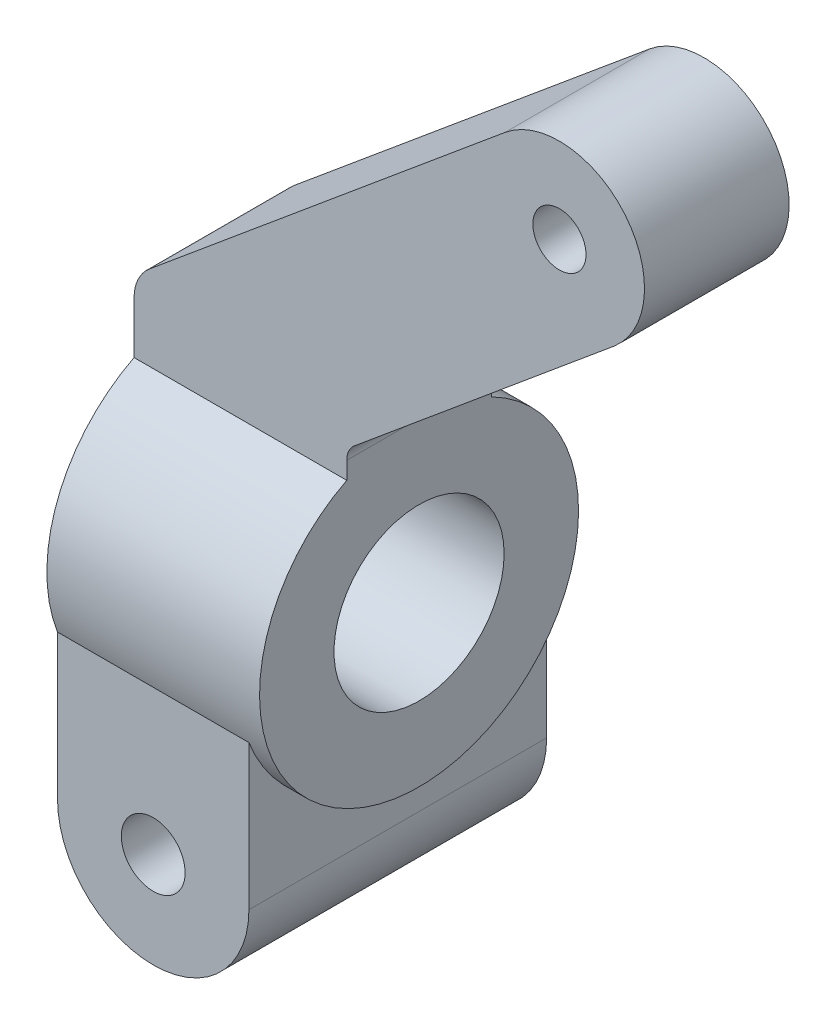
ISO-10303-21;
HEADER;
FILE_DESCRIPTION(('STEP AP214'),'2;1');
FILE_NAME('part.step','',(''),(''),'','','');
FILE_SCHEMA(('AUTOMOTIVE_DESIGN { 1 0 10303 214 1 1 1 1 }'));
ENDSEC;
DATA;
#1=APPLICATION_CONTEXT('core data for automotive mechanical design processes');
#2=APPLICATION_PROTOCOL_DEFINITION('international standard','automotive_design',2000,#1);
#3=PRODUCT_CONTEXT('',#1,'mechanical');
#4=PRODUCT('Part','Part','',(#3));
#5=PRODUCT_RELATED_PRODUCT_CATEGORY('part','',(#4));
#6=PRODUCT_DEFINITION_FORMATION('','',#4);
#7=PRODUCT_DEFINITION_CONTEXT('part definition',#1,'design');
#8=PRODUCT_DEFINITION('design','',#6,#7);
#9=PRODUCT_DEFINITION_SHAPE('','',#8);
#10=(LENGTH_UNIT() NAMED_UNIT(*) SI_UNIT(.MILLI.,.METRE.));
#11=(NAMED_UNIT(*) PLANE_ANGLE_UNIT() SI_UNIT($,.RADIAN.));
#12=(NAMED_UNIT(*) SI_UNIT($,.STERADIAN.) SOLID_ANGLE_UNIT());
#13=UNCERTAINTY_MEASURE_WITH_UNIT(LENGTH_MEASURE(1.E-05),#10,'distance_accuracy_value','');
#14=(GEOMETRIC_REPRESENTATION_CONTEXT(3) GLOBAL_UNCERTAINTY_ASSIGNED_CONTEXT((#13)) GLOBAL_UNIT_ASSIGNED_CONTEXT((#10,
#11,#12)) REPRESENTATION_CONTEXT('',''));
#15=CARTESIAN_POINT('',(0.,0.,0.));
#16=DIRECTION('',(0.,0.,1.));
#17=DIRECTION('',(1.,0.,0.));
#18=AXIS2_PLACEMENT_3D('',#15,#16,#17);
#19=CARTESIAN_POINT('',(10.,0.,0.));
#20=DIRECTION('',(-1.,0.,0.));
#21=DIRECTION('',(0.,0.,1.));
#22=AXIS2_PLACEMENT_3D('',#19,#20,#21);
#23=CYLINDRICAL_SURFACE('',#22,7.50000000000001);
#24=CARTESIAN_POINT('',(0.,0.,0.));
#25=DIRECTION('',(1.,0.,0.));
#26=DIRECTION('',(0.,0.,-1.));
#27=AXIS2_PLACEMENT_3D('',#24,#25,#26);
#28=CIRCLE('',#27,7.50000000000001);
#29=CARTESIAN_POINT('',(0.,6.68505796534332,3.4));
#30=VERTEX_POINT('',#29);
#31=CARTESIAN_POINT('',(0.,-2.69258240356727,7.));
#32=VERTEX_POINT('',#31);
#33=EDGE_CURVE('E209',#30,#32,#28,.T.);
#34=ORIENTED_EDGE('',*,*,#33,.T.);
#35=DIRECTION('',(-1.,0.,0.));
#36=VECTOR('',#35,1.);
#37=CARTESIAN_POINT('',(10.,-2.69258240356727,7.));
#38=LINE('',#37,#36);
#39=CARTESIAN_POINT('',(9.,-2.69258240356727,7.));
#40=VERTEX_POINT('',#39);
#41=EDGE_CURVE('E50',#32,#40,#38,.F.);
#42=ORIENTED_EDGE('',*,*,#41,.T.);
#43=CARTESIAN_POINT('',(9.,0.,0.));
#44=DIRECTION('',(1.,0.,0.));
#45=DIRECTION('',(0.,0.,-1.));
#46=AXIS2_PLACEMENT_3D('',#43,#44,#45);
#47=CIRCLE('',#46,7.50000000000001);
#48=CARTESIAN_POINT('',(9.,-2.69258240356727,-7.));
#49=VERTEX_POINT('',#48);
#50=EDGE_CURVE('E11',#40,#49,#47,.T.);
#51=ORIENTED_EDGE('',*,*,#50,.T.);
#52=DIRECTION('',(-1.,0.,0.));
#53=VECTOR('',#52,1.);
#54=CARTESIAN_POINT('',(10.,-2.69258240356727,-7.));
#55=LINE('',#54,#53);
#56=CARTESIAN_POINT('',(0.,-2.69258240356727,-7.));
#57=VERTEX_POINT('',#56);
#58=EDGE_CURVE('E56',#57,#49,#55,.F.);
#59=ORIENTED_EDGE('',*,*,#58,.F.);
#60=CARTESIAN_POINT('',(0.,6.68505796534332,-3.4));
#61=VERTEX_POINT('',#60);
#62=EDGE_CURVE('E206',#57,#61,#28,.T.);
#63=ORIENTED_EDGE('',*,*,#62,.T.);
#64=DIRECTION('',(-1.,0.,0.));
#65=VECTOR('',#64,1.);
#66=CARTESIAN_POINT('',(10.,6.68505796534332,-3.4));
#67=LINE('',#66,#65);
#68=CARTESIAN_POINT('',(10.,6.68505796534332,-3.4));
#69=VERTEX_POINT('',#68);
#70=EDGE_CURVE('E201',#69,#61,#67,.T.);
#71=ORIENTED_EDGE('',*,*,#70,.F.);
#72=CARTESIAN_POINT('',(10.,0.,0.));
#73=DIRECTION('',(1.,0.,0.));
#74=DIRECTION('',(0.,0.,-1.));
#75=AXIS2_PLACEMENT_3D('',#72,#73,#74);
#76=CIRCLE('',#75,7.50000000000001);
#77=CARTESIAN_POINT('',(10.,6.68505796534332,3.4));
#78=VERTEX_POINT('',#77);
#79=EDGE_CURVE('E43',#78,#69,#76,.T.);
#80=ORIENTED_EDGE('',*,*,#79,.F.);
#81=DIRECTION('',(-1.,0.,0.));
#82=VECTOR('',#81,1.);
#83=CARTESIAN_POINT('',(10.,6.68505796534332,3.4));
#84=LINE('',#83,#82);
#85=EDGE_CURVE('E204',#78,#30,#84,.T.);
#86=ORIENTED_EDGE('',*,*,#85,.T.);
#87=EDGE_LOOP('',(#34,#42,#51,#59,#63,#71,#80,#86));
#88=FACE_BOUND('',#87,.T.);
#89=ADVANCED_FACE('F35',(#88),#23,.T.);
#90=CARTESIAN_POINT('',(10.,0.,0.));
#91=DIRECTION('',(1.,0.,0.));
#92=DIRECTION('',(0.,0.,-1.));
#93=AXIS2_PLACEMENT_3D('',#90,#91,#92);
#94=PLANE('',#93);
#95=CARTESIAN_POINT('',(10.,0.,0.));
#96=DIRECTION('',(1.,0.,0.));
#97=DIRECTION('',(0.,0.,-1.));
#98=AXIS2_PLACEMENT_3D('',#95,#96,#97);
#99=CIRCLE('',#98,4.);
#100=CARTESIAN_POINT('',(10.,0.,-4.));
#101=VERTEX_POINT('',#100);
#102=EDGE_CURVE('E219',#101,#101,#99,.T.);
#103=ORIENTED_EDGE('',*,*,#102,.F.);
#104=EDGE_LOOP('',(#103));
#105=FACE_BOUND('',#104,.T.);
#106=DIRECTION('',(0.,1.,0.));
#107=VECTOR('',#106,1.);
#108=CARTESIAN_POINT('',(10.,7.50000000000001,-3.4));
#109=LINE('',#108,#107);
#110=CARTESIAN_POINT('',(10.,7.50000000000001,-3.4));
#111=VERTEX_POINT('',#110);
#112=EDGE_CURVE('E153',#69,#111,#109,.T.);
#113=ORIENTED_EDGE('',*,*,#112,.T.);
#114=DIRECTION('',(0.,0.,-1.));
#115=VECTOR('',#114,1.);
#116=CARTESIAN_POINT('',(10.,7.50000000000001,3.4));
#117=LINE('',#116,#115);
#118=CARTESIAN_POINT('',(10.,7.50000000000001,3.4));
#119=VERTEX_POINT('',#118);
#120=EDGE_CURVE('E199',#119,#111,#117,.T.);
#121=ORIENTED_EDGE('',*,*,#120,.F.);
#122=DIRECTION('',(0.,1.,0.));
#123=VECTOR('',#122,1.);
#124=CARTESIAN_POINT('',(10.,7.50000000000001,3.4));
#125=LINE('',#124,#123);
#126=EDGE_CURVE('E154',#78,#119,#125,.T.);
#127=ORIENTED_EDGE('',*,*,#126,.F.);
#128=ORIENTED_EDGE('',*,*,#79,.T.);
#129=EDGE_LOOP('',(#113,#121,#127,#128));
#130=FACE_BOUND('',#129,.T.);
#131=ADVANCED_FACE('F237',(#105,#130),#94,.T.);
#132=CARTESIAN_POINT('',(0.,0.,0.));
#133=DIRECTION('',(1.,0.,0.));
#134=DIRECTION('',(0.,0.,-1.));
#135=AXIS2_PLACEMENT_3D('',#132,#133,#134);
#136=PLANE('',#135);
#137=CARTESIAN_POINT('',(0.,0.,0.));
#138=DIRECTION('',(1.,0.,0.));
#139=DIRECTION('',(0.,0.,-1.));
#140=AXIS2_PLACEMENT_3D('',#137,#138,#139);
#141=CIRCLE('',#140,4.);
#142=CARTESIAN_POINT('',(0.,0.,-4.));
#143=VERTEX_POINT('',#142);
#144=EDGE_CURVE('E213',#143,#143,#141,.T.);
#145=ORIENTED_EDGE('',*,*,#144,.T.);
#146=EDGE_LOOP('',(#145));
#147=FACE_BOUND('',#146,.T.);
#148=ORIENTED_EDGE('',*,*,#62,.F.);
#149=DIRECTION('',(0.,-1.,0.));
#150=VECTOR('',#149,1.);
#151=CARTESIAN_POINT('',(0.,0.,-7.));
#152=LINE('',#151,#150);
#153=CARTESIAN_POINT('',(0.,-9.50000000000001,-7.));
#154=VERTEX_POINT('',#153);
#155=EDGE_CURVE('E145',#57,#154,#152,.T.);
#156=ORIENTED_EDGE('',*,*,#155,.T.);
#157=DIRECTION('',(0.,0.,-1.));
#158=VECTOR('',#157,1.);
#159=CARTESIAN_POINT('',(0.,-9.50000000000001,7.));
#160=LINE('',#159,#158);
#161=CARTESIAN_POINT('',(0.,-9.50000000000001,7.));
#162=VERTEX_POINT('',#161);
#163=EDGE_CURVE('E138',#162,#154,#160,.T.);
#164=ORIENTED_EDGE('',*,*,#163,.F.);
#165=DIRECTION('',(0.,-1.,0.));
#166=VECTOR('',#165,1.);
#167=CARTESIAN_POINT('',(0.,0.,7.));
#168=LINE('',#167,#166);
#169=EDGE_CURVE('E123',#32,#162,#168,.T.);
#170=ORIENTED_EDGE('',*,*,#169,.F.);
#171=ORIENTED_EDGE('',*,*,#33,.F.);
#172=DIRECTION('',(0.,-1.,0.));
#173=VECTOR('',#172,1.);
#174=CARTESIAN_POINT('',(0.,0.,3.4));
#175=LINE('',#174,#173);
#176=CARTESIAN_POINT('',(0.,9.11512231374741,3.4));
#177=VERTEX_POINT('',#176);
#178=EDGE_CURVE('E167',#177,#30,#175,.T.);
#179=ORIENTED_EDGE('',*,*,#178,.F.);
#180=DIRECTION('',(0.,0.,-1.));
#181=VECTOR('',#180,1.);
#182=CARTESIAN_POINT('',(0.,9.11512231374741,3.4));
#183=LINE('',#182,#181);
#184=CARTESIAN_POINT('',(0.,9.11512231374741,-3.4));
#185=VERTEX_POINT('',#184);
#186=EDGE_CURVE('E170',#177,#185,#183,.T.);
#187=ORIENTED_EDGE('',*,*,#186,.T.);
#188=DIRECTION('',(0.,-1.,0.));
#189=VECTOR('',#188,1.);
#190=CARTESIAN_POINT('',(0.,0.,-3.4));
#191=LINE('',#190,#189);
#192=EDGE_CURVE('E157',#185,#61,#191,.T.);
#193=ORIENTED_EDGE('',*,*,#192,.T.);
#194=EDGE_LOOP('',(#148,#156,#164,#170,#171,#179,#187,#193));
#195=FACE_BOUND('',#194,.T.);
#196=ADVANCED_FACE('F143',(#147,#195),#136,.F.);
#197=CARTESIAN_POINT('',(11.,7.50000000000001,3.4));
#198=DIRECTION('',(0.,0.,1.));
#199=DIRECTION('',(1.,0.,0.));
#200=AXIS2_PLACEMENT_3D('',#197,#198,#199);
#201=PLANE('',#200);
#202=CARTESIAN_POINT('',(20.,21.5,3.4));
#203=DIRECTION('',(0.,0.,1.));
#204=DIRECTION('',(1.,0.,0.));
#205=AXIS2_PLACEMENT_3D('',#202,#203,#204);
#206=CIRCLE('',#205,1.25);
#207=CARTESIAN_POINT('',(21.25,21.5,3.4));
#208=VERTEX_POINT('',#207);
#209=EDGE_CURVE('E224',#208,#208,#206,.T.);
#210=ORIENTED_EDGE('',*,*,#209,.F.);
#211=EDGE_LOOP('',(#210));
#212=FACE_BOUND('',#211,.T.);
#213=ORIENTED_EDGE('',*,*,#85,.F.);
#214=ORIENTED_EDGE('',*,*,#126,.T.);
#215=CARTESIAN_POINT('',(11.,7.50000000000001,3.4));
#216=DIRECTION('',(0.,0.,-1.));
#217=DIRECTION('',(1.,0.,0.));
#218=AXIS2_PLACEMENT_3D('',#215,#216,#217);
#219=CIRCLE('',#218,0.999999999999999);
#220=CARTESIAN_POINT('',(10.3601331764281,8.26848581515339,3.4));
#221=VERTEX_POINT('',#220);
#222=EDGE_CURVE('E156',#119,#221,#219,.T.);
#223=ORIENTED_EDGE('',*,*,#222,.T.);
#224=DIRECTION('',(0.768485815153386,0.639866823571934,0.));
#225=VECTOR('',#224,1.);
#226=CARTESIAN_POINT('',(22.5594672942877,18.4260567393865,3.4));
#227=LINE('',#226,#225);
#228=CARTESIAN_POINT('',(22.5594672942877,18.4260567393865,3.4));
#229=VERTEX_POINT('',#228);
#230=EDGE_CURVE('E159',#221,#229,#227,.T.);
#231=ORIENTED_EDGE('',*,*,#230,.T.);
#232=CARTESIAN_POINT('',(20.,21.5,3.4));
#233=DIRECTION('',(0.,0.,1.));
#234=DIRECTION('',(1.,0.,0.));
#235=AXIS2_PLACEMENT_3D('',#232,#233,#234);
#236=CIRCLE('',#235,4.);
#237=CARTESIAN_POINT('',(17.4405327057123,24.5739432606136,3.4));
#238=VERTEX_POINT('',#237);
#239=EDGE_CURVE('E161',#229,#238,#236,.T.);
#240=ORIENTED_EDGE('',*,*,#239,.T.);
#241=DIRECTION('',(-0.768485815153386,-0.639866823571934,0.));
#242=VECTOR('',#241,1.);
#243=CARTESIAN_POINT('',(0.720266352856132,10.6520939440542,3.4));
#244=LINE('',#243,#242);
#245=CARTESIAN_POINT('',(0.720266352856133,10.6520939440542,3.4));
#246=VERTEX_POINT('',#245);
#247=EDGE_CURVE('E163',#238,#246,#244,.T.);
#248=ORIENTED_EDGE('',*,*,#247,.T.);
#249=CARTESIAN_POINT('',(2.,9.11512231374741,3.4));
#250=DIRECTION('',(0.,0.,1.));
#251=DIRECTION('',(-1.,0.,0.));
#252=AXIS2_PLACEMENT_3D('',#249,#250,#251);
#253=CIRCLE('',#252,2.);
#254=EDGE_CURVE('E165',#246,#177,#253,.T.);
#255=ORIENTED_EDGE('',*,*,#254,.T.);
#256=ORIENTED_EDGE('',*,*,#178,.T.);
#257=EDGE_LOOP('',(#213,#214,#223,#231,#240,#248,#255,#256));
#258=FACE_BOUND('',#257,.T.);
#259=ADVANCED_FACE('F246',(#212,#258),#201,.T.);
#260=CARTESIAN_POINT('',(11.,7.50000000000001,-3.4));
#261=DIRECTION('',(0.,0.,1.));
#262=DIRECTION('',(1.,0.,0.));
#263=AXIS2_PLACEMENT_3D('',#260,#261,#262);
#264=PLANE('',#263);
#265=CARTESIAN_POINT('',(20.,21.5,-3.4));
#266=DIRECTION('',(0.,0.,1.));
#267=DIRECTION('',(1.,0.,0.));
#268=AXIS2_PLACEMENT_3D('',#265,#266,#267);
#269=CIRCLE('',#268,1.25);
#270=CARTESIAN_POINT('',(21.25,21.5,-3.4));
#271=VERTEX_POINT('',#270);
#272=EDGE_CURVE('E38',#271,#271,#269,.T.);
#273=ORIENTED_EDGE('',*,*,#272,.T.);
#274=EDGE_LOOP('',(#273));
#275=FACE_BOUND('',#274,.T.);
#276=ORIENTED_EDGE('',*,*,#112,.F.);
#277=ORIENTED_EDGE('',*,*,#70,.T.);
#278=ORIENTED_EDGE('',*,*,#192,.F.);
#279=CARTESIAN_POINT('',(2.,9.11512231374741,-3.4));
#280=DIRECTION('',(0.,0.,1.));
#281=DIRECTION('',(-1.,0.,0.));
#282=AXIS2_PLACEMENT_3D('',#279,#280,#281);
#283=CIRCLE('',#282,2.);
#284=CARTESIAN_POINT('',(0.720266352856133,10.6520939440542,-3.4));
#285=VERTEX_POINT('',#284);
#286=EDGE_CURVE('E181',#285,#185,#283,.T.);
#287=ORIENTED_EDGE('',*,*,#286,.F.);
#288=DIRECTION('',(-0.768485815153386,-0.639866823571934,0.));
#289=VECTOR('',#288,1.);
#290=CARTESIAN_POINT('',(0.720266352856132,10.6520939440542,-3.4));
#291=LINE('',#290,#289);
#292=CARTESIAN_POINT('',(17.4405327057123,24.5739432606136,-3.4));
#293=VERTEX_POINT('',#292);
#294=EDGE_CURVE('E179',#293,#285,#291,.T.);
#295=ORIENTED_EDGE('',*,*,#294,.F.);
#296=CARTESIAN_POINT('',(20.,21.5,-3.4));
#297=DIRECTION('',(0.,0.,1.));
#298=DIRECTION('',(1.,0.,0.));
#299=AXIS2_PLACEMENT_3D('',#296,#297,#298);
#300=CIRCLE('',#299,4.);
#301=CARTESIAN_POINT('',(22.5594672942877,18.4260567393865,-3.4));
#302=VERTEX_POINT('',#301);
#303=EDGE_CURVE('E177',#302,#293,#300,.T.);
#304=ORIENTED_EDGE('',*,*,#303,.F.);
#305=DIRECTION('',(0.768485815153386,0.639866823571934,0.));
#306=VECTOR('',#305,1.);
#307=CARTESIAN_POINT('',(22.5594672942877,18.4260567393865,-3.4));
#308=LINE('',#307,#306);
#309=CARTESIAN_POINT('',(10.3601331764281,8.26848581515339,-3.4));
#310=VERTEX_POINT('',#309);
#311=EDGE_CURVE('E175',#310,#302,#308,.T.);
#312=ORIENTED_EDGE('',*,*,#311,.F.);
#313=CARTESIAN_POINT('',(11.,7.50000000000001,-3.4));
#314=DIRECTION('',(0.,0.,-1.));
#315=DIRECTION('',(1.,0.,0.));
#316=AXIS2_PLACEMENT_3D('',#313,#314,#315);
#317=CIRCLE('',#316,0.999999999999999);
#318=EDGE_CURVE('E173',#111,#310,#317,.T.);
#319=ORIENTED_EDGE('',*,*,#318,.F.);
#320=EDGE_LOOP('',(#276,#277,#278,#287,#295,#304,#312,#319));
#321=FACE_BOUND('',#320,.T.);
#322=ADVANCED_FACE('F254',(#275,#321),#264,.F.);
#323=CARTESIAN_POINT('',(11.,7.50000000000001,3.4));
#324=DIRECTION('',(0.,0.,-1.));
#325=DIRECTION('',(-1.,0.,0.));
#326=AXIS2_PLACEMENT_3D('',#323,#324,#325);
#327=CYLINDRICAL_SURFACE('',#326,0.999999999999999);
#328=ORIENTED_EDGE('',*,*,#318,.T.);
#329=DIRECTION('',(0.,0.,-1.));
#330=VECTOR('',#329,1.);
#331=CARTESIAN_POINT('',(10.3601331764281,8.26848581515339,3.4));
#332=LINE('',#331,#330);
#333=EDGE_CURVE('E196',#221,#310,#332,.T.);
#334=ORIENTED_EDGE('',*,*,#333,.F.);
#335=ORIENTED_EDGE('',*,*,#222,.F.);
#336=ORIENTED_EDGE('',*,*,#120,.T.);
#337=EDGE_LOOP('',(#328,#334,#335,#336));
#338=FACE_BOUND('',#337,.T.);
#339=ADVANCED_FACE('F250',(#338),#327,.F.);
#340=CARTESIAN_POINT('',(22.5594672942877,18.4260567393865,3.4));
#341=DIRECTION('',(-0.639866823571934,0.768485815153386,0.));
#342=DIRECTION('',(-0.768485815153386,-0.639866823571934,0.));
#343=AXIS2_PLACEMENT_3D('',#340,#341,#342);
#344=PLANE('',#343);
#345=ORIENTED_EDGE('',*,*,#311,.T.);
#346=DIRECTION('',(0.,0.,-1.));
#347=VECTOR('',#346,1.);
#348=CARTESIAN_POINT('',(22.5594672942877,18.4260567393865,3.4));
#349=LINE('',#348,#347);
#350=EDGE_CURVE('E193',#229,#302,#349,.T.);
#351=ORIENTED_EDGE('',*,*,#350,.F.);
#352=ORIENTED_EDGE('',*,*,#230,.F.);
#353=ORIENTED_EDGE('',*,*,#333,.T.);
#354=EDGE_LOOP('',(#345,#351,#352,#353));
#355=FACE_BOUND('',#354,.T.);
#356=ADVANCED_FACE('F253',(#355),#344,.F.);
#357=CARTESIAN_POINT('',(20.,21.5,3.4));
#358=DIRECTION('',(0.,0.,-1.));
#359=DIRECTION('',(-1.,0.,0.));
#360=AXIS2_PLACEMENT_3D('',#357,#358,#359);
#361=CYLINDRICAL_SURFACE('',#360,4.);
#362=ORIENTED_EDGE('',*,*,#303,.T.);
#363=DIRECTION('',(0.,0.,-1.));
#364=VECTOR('',#363,1.);
#365=CARTESIAN_POINT('',(17.4405327057123,24.5739432606136,3.4));
#366=LINE('',#365,#364);
#367=EDGE_CURVE('E190',#238,#293,#366,.T.);
#368=ORIENTED_EDGE('',*,*,#367,.F.);
#369=ORIENTED_EDGE('',*,*,#239,.F.);
#370=ORIENTED_EDGE('',*,*,#350,.T.);
#371=EDGE_LOOP('',(#362,#368,#369,#370));
#372=FACE_BOUND('',#371,.T.);
#373=ADVANCED_FACE('F258',(#372),#361,.T.);
#374=CARTESIAN_POINT('',(0.720266352856132,10.6520939440542,3.4));
#375=DIRECTION('',(0.639866823571934,-0.768485815153386,0.));
#376=DIRECTION('',(0.768485815153386,0.639866823571934,0.));
#377=AXIS2_PLACEMENT_3D('',#374,#375,#376);
#378=PLANE('',#377);
#379=ORIENTED_EDGE('',*,*,#294,.T.);
#380=DIRECTION('',(0.,0.,-1.));
#381=VECTOR('',#380,1.);
#382=CARTESIAN_POINT('',(0.720266352856133,10.6520939440542,3.4));
#383=LINE('',#382,#381);
#384=EDGE_CURVE('E187',#246,#285,#383,.T.);
#385=ORIENTED_EDGE('',*,*,#384,.F.);
#386=ORIENTED_EDGE('',*,*,#247,.F.);
#387=ORIENTED_EDGE('',*,*,#367,.T.);
#388=EDGE_LOOP('',(#379,#385,#386,#387));
#389=FACE_BOUND('',#388,.T.);
#390=ADVANCED_FACE('F262',(#389),#378,.F.);
#391=CARTESIAN_POINT('',(2.,9.11512231374741,3.4));
#392=DIRECTION('',(0.,0.,-1.));
#393=DIRECTION('',(-1.,0.,0.));
#394=AXIS2_PLACEMENT_3D('',#391,#392,#393);
#395=CYLINDRICAL_SURFACE('',#394,2.);
#396=ORIENTED_EDGE('',*,*,#286,.T.);
#397=ORIENTED_EDGE('',*,*,#186,.F.);
#398=ORIENTED_EDGE('',*,*,#254,.F.);
#399=ORIENTED_EDGE('',*,*,#384,.T.);
#400=EDGE_LOOP('',(#396,#397,#398,#399));
#401=FACE_BOUND('',#400,.T.);
#402=ADVANCED_FACE('F266',(#401),#395,.T.);
#403=CARTESIAN_POINT('',(0.,0.,7.));
#404=DIRECTION('',(0.,0.,1.));
#405=DIRECTION('',(1.,0.,0.));
#406=AXIS2_PLACEMENT_3D('',#403,#404,#405);
#407=PLANE('',#406);
#408=CARTESIAN_POINT('',(4.5,-9.50000000000001,7.));
#409=DIRECTION('',(0.,0.,1.));
#410=DIRECTION('',(1.,0.,0.));
#411=AXIS2_PLACEMENT_3D('',#408,#409,#410);
#412=CIRCLE('',#411,1.5);
#413=CARTESIAN_POINT('',(6.,-9.50000000000001,7.));
#414=VERTEX_POINT('',#413);
#415=EDGE_CURVE('E212',#414,#414,#412,.T.);
#416=ORIENTED_EDGE('',*,*,#415,.F.);
#417=EDGE_LOOP('',(#416));
#418=FACE_BOUND('',#417,.T.);
#419=ORIENTED_EDGE('',*,*,#41,.F.);
#420=ORIENTED_EDGE('',*,*,#169,.T.);
#421=CARTESIAN_POINT('',(4.5,-9.50000000000001,7.));
#422=DIRECTION('',(0.,0.,1.));
#423=DIRECTION('',(1.,0.,0.));
#424=AXIS2_PLACEMENT_3D('',#421,#422,#423);
#425=CIRCLE('',#424,4.5);
#426=CARTESIAN_POINT('',(9.,-9.50000000000001,7.));
#427=VERTEX_POINT('',#426);
#428=EDGE_CURVE('E127',#162,#427,#425,.T.);
#429=ORIENTED_EDGE('',*,*,#428,.T.);
#430=DIRECTION('',(0.,-1.,0.));
#431=VECTOR('',#430,1.);
#432=CARTESIAN_POINT('',(9.,0.,7.));
#433=LINE('',#432,#431);
#434=EDGE_CURVE('E141',#40,#427,#433,.T.);
#435=ORIENTED_EDGE('',*,*,#434,.F.);
#436=EDGE_LOOP('',(#419,#420,#429,#435));
#437=FACE_BOUND('',#436,.T.);
#438=ADVANCED_FACE('F125',(#418,#437),#407,.T.);
#439=CARTESIAN_POINT('',(0.,0.,-7.));
#440=DIRECTION('',(0.,0.,1.));
#441=DIRECTION('',(1.,0.,0.));
#442=AXIS2_PLACEMENT_3D('',#439,#440,#441);
#443=PLANE('',#442);
#444=CARTESIAN_POINT('',(4.5,-9.50000000000001,-7.));
#445=DIRECTION('',(0.,0.,1.));
#446=DIRECTION('',(1.,0.,0.));
#447=AXIS2_PLACEMENT_3D('',#444,#445,#446);
#448=CIRCLE('',#447,1.5);
#449=CARTESIAN_POINT('',(6.,-9.50000000000001,-7.));
#450=VERTEX_POINT('',#449);
#451=EDGE_CURVE('E210',#450,#450,#448,.T.);
#452=ORIENTED_EDGE('',*,*,#451,.T.);
#453=EDGE_LOOP('',(#452));
#454=FACE_BOUND('',#453,.T.);
#455=ORIENTED_EDGE('',*,*,#155,.F.);
#456=ORIENTED_EDGE('',*,*,#58,.T.);
#457=DIRECTION('',(0.,-1.,0.));
#458=VECTOR('',#457,1.);
#459=CARTESIAN_POINT('',(9.,0.,-7.));
#460=LINE('',#459,#458);
#461=CARTESIAN_POINT('',(9.,-9.50000000000001,-7.));
#462=VERTEX_POINT('',#461);
#463=EDGE_CURVE('E132',#49,#462,#460,.T.);
#464=ORIENTED_EDGE('',*,*,#463,.T.);
#465=CARTESIAN_POINT('',(4.5,-9.50000000000001,-7.));
#466=DIRECTION('',(0.,0.,1.));
#467=DIRECTION('',(1.,0.,0.));
#468=AXIS2_PLACEMENT_3D('',#465,#466,#467);
#469=CIRCLE('',#468,4.5);
#470=EDGE_CURVE('E230',#154,#462,#469,.T.);
#471=ORIENTED_EDGE('',*,*,#470,.F.);
#472=EDGE_LOOP('',(#455,#456,#464,#471));
#473=FACE_BOUND('',#472,.T.);
#474=ADVANCED_FACE('F233',(#454,#473),#443,.F.);
#475=CARTESIAN_POINT('',(4.5,-9.50000000000001,7.));
#476=DIRECTION('',(0.,0.,-1.));
#477=DIRECTION('',(-1.,0.,0.));
#478=AXIS2_PLACEMENT_3D('',#475,#476,#477);
#479=CYLINDRICAL_SURFACE('',#478,4.5);
#480=ORIENTED_EDGE('',*,*,#470,.T.);
#481=DIRECTION('',(0.,0.,-1.));
#482=VECTOR('',#481,1.);
#483=CARTESIAN_POINT('',(9.,-9.50000000000001,7.));
#484=LINE('',#483,#482);
#485=EDGE_CURVE('E140',#427,#462,#484,.T.);
#486=ORIENTED_EDGE('',*,*,#485,.F.);
#487=ORIENTED_EDGE('',*,*,#428,.F.);
#488=ORIENTED_EDGE('',*,*,#163,.T.);
#489=EDGE_LOOP('',(#480,#486,#487,#488));
#490=FACE_BOUND('',#489,.T.);
#491=ADVANCED_FACE('F137',(#490),#479,.T.);
#492=CARTESIAN_POINT('',(9.,0.,7.));
#493=DIRECTION('',(1.,0.,0.));
#494=DIRECTION('',(0.,0.,-1.));
#495=AXIS2_PLACEMENT_3D('',#492,#493,#494);
#496=PLANE('',#495);
#497=ORIENTED_EDGE('',*,*,#50,.F.);
#498=ORIENTED_EDGE('',*,*,#434,.T.);
#499=ORIENTED_EDGE('',*,*,#485,.T.);
#500=ORIENTED_EDGE('',*,*,#463,.F.);
#501=EDGE_LOOP('',(#497,#498,#499,#500));
#502=FACE_BOUND('',#501,.T.);
#503=ADVANCED_FACE('F235',(#502),#496,.T.);
#504=CARTESIAN_POINT('',(4.5,-9.50000000000001,-7.50000000000001));
#505=DIRECTION('',(0.,0.,1.));
#506=DIRECTION('',(1.,0.,0.));
#507=AXIS2_PLACEMENT_3D('',#504,#505,#506);
#508=CYLINDRICAL_SURFACE('',#507,1.5);
#509=ORIENTED_EDGE('',*,*,#415,.T.);
#510=EDGE_LOOP('',(#509));
#511=FACE_BOUND('',#510,.T.);
#512=ORIENTED_EDGE('',*,*,#451,.F.);
#513=EDGE_LOOP('',(#512));
#514=FACE_BOUND('',#513,.T.);
#515=ADVANCED_FACE('F281',(#511,#514),#508,.F.);
#516=CARTESIAN_POINT('',(0.,0.,0.));
#517=DIRECTION('',(1.,0.,0.));
#518=DIRECTION('',(0.,0.,-1.));
#519=AXIS2_PLACEMENT_3D('',#516,#517,#518);
#520=CYLINDRICAL_SURFACE('',#519,4.);
#521=ORIENTED_EDGE('',*,*,#144,.F.);
#522=EDGE_LOOP('',(#521));
#523=FACE_BOUND('',#522,.T.);
#524=ORIENTED_EDGE('',*,*,#102,.T.);
#525=EDGE_LOOP('',(#524));
#526=FACE_BOUND('',#525,.T.);
#527=ADVANCED_FACE('F289',(#523,#526),#520,.F.);
#528=CARTESIAN_POINT('',(20.,21.5,-7.50000000000001));
#529=DIRECTION('',(0.,0.,1.));
#530=DIRECTION('',(1.,0.,0.));
#531=AXIS2_PLACEMENT_3D('',#528,#529,#530);
#532=CYLINDRICAL_SURFACE('',#531,1.25);
#533=ORIENTED_EDGE('',*,*,#209,.T.);
#534=EDGE_LOOP('',(#533));
#535=FACE_BOUND('',#534,.T.);
#536=ORIENTED_EDGE('',*,*,#272,.F.);
#537=EDGE_LOOP('',(#536));
#538=FACE_BOUND('',#537,.T.);
#539=ADVANCED_FACE('F293',(#535,#538),#532,.F.);
#540=CLOSED_SHELL('',(#89,#131,#196,#259,#322,#339,#356,#373,#390,#402,#438,#474,#491,#503,#515,
#527,#539));
#541=MANIFOLD_SOLID_BREP('B2',#540);
#542=ADVANCED_BREP_SHAPE_REPRESENTATION('',(#18,#541),#14);
#543=SHAPE_DEFINITION_REPRESENTATION(#9,#542);
ENDSEC;
END-ISO-10303-21;
